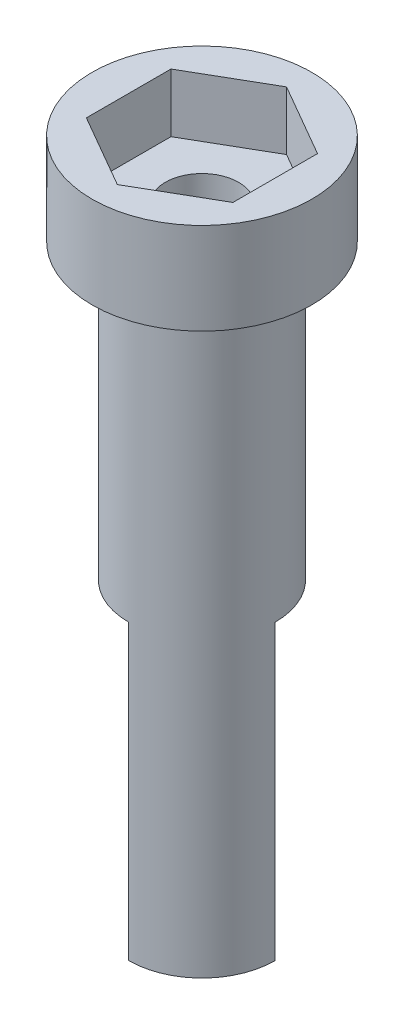
ISO-10303-21;
HEADER;
FILE_DESCRIPTION(('STEP AP214'),'2;1');
FILE_NAME('part.step','',(''),(''),'','','');
FILE_SCHEMA(('AUTOMOTIVE_DESIGN { 1 0 10303 214 1 1 1 1 }'));
ENDSEC;
DATA;
#1=APPLICATION_CONTEXT('core data for automotive mechanical design processes');
#2=APPLICATION_PROTOCOL_DEFINITION('international standard','automotive_design',2000,#1);
#3=PRODUCT_CONTEXT('',#1,'mechanical');
#4=PRODUCT('Part','Part','',(#3));
#5=PRODUCT_RELATED_PRODUCT_CATEGORY('part','',(#4));
#6=PRODUCT_DEFINITION_FORMATION('','',#4);
#7=PRODUCT_DEFINITION_CONTEXT('part definition',#1,'design');
#8=PRODUCT_DEFINITION('design','',#6,#7);
#9=PRODUCT_DEFINITION_SHAPE('','',#8);
#10=(LENGTH_UNIT() NAMED_UNIT(*) SI_UNIT(.MILLI.,.METRE.));
#11=(NAMED_UNIT(*) PLANE_ANGLE_UNIT() SI_UNIT($,.RADIAN.));
#12=(NAMED_UNIT(*) SI_UNIT($,.STERADIAN.) SOLID_ANGLE_UNIT());
#13=UNCERTAINTY_MEASURE_WITH_UNIT(LENGTH_MEASURE(1.E-05),#10,'distance_accuracy_value','');
#14=(GEOMETRIC_REPRESENTATION_CONTEXT(3) GLOBAL_UNCERTAINTY_ASSIGNED_CONTEXT((#13)) GLOBAL_UNIT_ASSIGNED_CONTEXT((#10,
#11,#12)) REPRESENTATION_CONTEXT('',''));
#15=CARTESIAN_POINT('',(0.,0.,0.));
#16=DIRECTION('',(0.,0.,1.));
#17=DIRECTION('',(1.,0.,0.));
#18=AXIS2_PLACEMENT_3D('',#15,#16,#17);
#19=CARTESIAN_POINT('',(0.,29.,0.));
#20=DIRECTION('',(0.,-1.,0.));
#21=DIRECTION('',(0.,0.,-1.));
#22=AXIS2_PLACEMENT_3D('',#19,#20,#21);
#23=CYLINDRICAL_SURFACE('',#22,2.);
#24=CARTESIAN_POINT('',(0.,26.5,0.));
#25=DIRECTION('',(0.,1.,0.));
#26=DIRECTION('',(0.,0.,1.));
#27=AXIS2_PLACEMENT_3D('',#24,#25,#26);
#28=CIRCLE('',#27,2.);
#29=CARTESIAN_POINT('',(0.,26.5,2.));
#30=VERTEX_POINT('',#29);
#31=EDGE_CURVE('E241',#30,#30,#28,.T.);
#32=ORIENTED_EDGE('',*,*,#31,.F.);
#33=EDGE_LOOP('',(#32));
#34=FACE_BOUND('',#33,.T.);
#35=DIRECTION('',(0.,-1.,0.));
#36=VECTOR('',#35,1.);
#37=CARTESIAN_POINT('',(2.,18.5,0.));
#38=LINE('',#37,#36);
#39=CARTESIAN_POINT('',(2.,18.5,0.));
#40=VERTEX_POINT('',#39);
#41=CARTESIAN_POINT('',(2.,10.5,0.));
#42=VERTEX_POINT('',#41);
#43=EDGE_CURVE('E146',#40,#42,#38,.T.);
#44=ORIENTED_EDGE('',*,*,#43,.F.);
#45=CARTESIAN_POINT('',(0.,18.5,0.));
#46=DIRECTION('',(0.,1.,0.));
#47=DIRECTION('',(0.,0.,1.));
#48=AXIS2_PLACEMENT_3D('',#45,#46,#47);
#49=CIRCLE('',#48,2.);
#50=CARTESIAN_POINT('',(0.,18.5,-2.));
#51=VERTEX_POINT('',#50);
#52=EDGE_CURVE('E152',#40,#51,#49,.T.);
#53=ORIENTED_EDGE('',*,*,#52,.T.);
#54=DIRECTION('',(0.,-1.,0.));
#55=VECTOR('',#54,1.);
#56=CARTESIAN_POINT('',(0.,18.5,-2.));
#57=LINE('',#56,#55);
#58=CARTESIAN_POINT('',(0.,10.5,-2.));
#59=VERTEX_POINT('',#58);
#60=EDGE_CURVE('E164',#51,#59,#57,.T.);
#61=ORIENTED_EDGE('',*,*,#60,.T.);
#62=CARTESIAN_POINT('',(0.,10.5,0.));
#63=DIRECTION('',(0.,1.,0.));
#64=DIRECTION('',(0.,0.,1.));
#65=AXIS2_PLACEMENT_3D('',#62,#63,#64);
#66=CIRCLE('',#65,2.);
#67=CARTESIAN_POINT('',(-2.,10.5,0.));
#68=VERTEX_POINT('',#67);
#69=EDGE_CURVE('E63',#59,#68,#66,.T.);
#70=ORIENTED_EDGE('',*,*,#69,.T.);
#71=DIRECTION('',(0.,-1.,0.));
#72=VECTOR('',#71,1.);
#73=CARTESIAN_POINT('',(-2.,18.5,0.));
#74=LINE('',#73,#72);
#75=CARTESIAN_POINT('',(-2.,18.5,0.));
#76=VERTEX_POINT('',#75);
#77=EDGE_CURVE('E183',#76,#68,#74,.T.);
#78=ORIENTED_EDGE('',*,*,#77,.F.);
#79=CARTESIAN_POINT('',(0.,18.5,0.));
#80=DIRECTION('',(0.,1.,0.));
#81=DIRECTION('',(0.,0.,1.));
#82=AXIS2_PLACEMENT_3D('',#79,#80,#81);
#83=CIRCLE('',#82,2.);
#84=CARTESIAN_POINT('',(0.,18.5,2.));
#85=VERTEX_POINT('',#84);
#86=EDGE_CURVE('E174',#76,#85,#83,.T.);
#87=ORIENTED_EDGE('',*,*,#86,.T.);
#88=DIRECTION('',(0.,-1.,0.));
#89=VECTOR('',#88,1.);
#90=CARTESIAN_POINT('',(0.,18.5,2.));
#91=LINE('',#90,#89);
#92=CARTESIAN_POINT('',(0.,10.5,2.));
#93=VERTEX_POINT('',#92);
#94=EDGE_CURVE('E180',#85,#93,#91,.T.);
#95=ORIENTED_EDGE('',*,*,#94,.T.);
#96=EDGE_CURVE('E163',#93,#42,#66,.T.);
#97=ORIENTED_EDGE('',*,*,#96,.T.);
#98=EDGE_LOOP('',(#44,#53,#61,#70,#78,#87,#95,#97));
#99=FACE_BOUND('',#98,.T.);
#100=ADVANCED_FACE('F41',(#34,#99),#23,.T.);
#101=CARTESIAN_POINT('',(0.,29.,0.));
#102=DIRECTION('',(0.,-1.,0.));
#103=DIRECTION('',(0.,0.,-1.));
#104=AXIS2_PLACEMENT_3D('',#101,#102,#103);
#105=CYLINDRICAL_SURFACE('',#104,1.);
#106=CARTESIAN_POINT('',(0.,27.4,0.));
#107=DIRECTION('',(0.,-1.,0.));
#108=DIRECTION('',(0.,0.,-1.));
#109=AXIS2_PLACEMENT_3D('',#106,#107,#108);
#110=CIRCLE('',#109,1.);
#111=CARTESIAN_POINT('',(0.,27.4,-1.));
#112=VERTEX_POINT('',#111);
#113=EDGE_CURVE('E237',#112,#112,#110,.T.);
#114=ORIENTED_EDGE('',*,*,#113,.F.);
#115=EDGE_LOOP('',(#114));
#116=FACE_BOUND('',#115,.T.);
#117=CARTESIAN_POINT('',(0.,18.5,0.));
#118=DIRECTION('',(0.,1.,0.));
#119=DIRECTION('',(0.,0.,1.));
#120=AXIS2_PLACEMENT_3D('',#117,#118,#119);
#121=CIRCLE('',#120,1.);
#122=CARTESIAN_POINT('',(1.,18.5,0.));
#123=VERTEX_POINT('',#122);
#124=CARTESIAN_POINT('',(0.,18.5,-1.));
#125=VERTEX_POINT('',#124);
#126=EDGE_CURVE('E11',#123,#125,#121,.T.);
#127=ORIENTED_EDGE('',*,*,#126,.F.);
#128=DIRECTION('',(0.,-1.,0.));
#129=VECTOR('',#128,1.);
#130=CARTESIAN_POINT('',(1.,29.,0.));
#131=LINE('',#130,#129);
#132=CARTESIAN_POINT('',(1.,10.5,0.));
#133=VERTEX_POINT('',#132);
#134=EDGE_CURVE('E149',#123,#133,#131,.T.);
#135=ORIENTED_EDGE('',*,*,#134,.T.);
#136=CARTESIAN_POINT('',(0.,10.5,0.));
#137=DIRECTION('',(0.,1.,0.));
#138=DIRECTION('',(0.,0.,1.));
#139=AXIS2_PLACEMENT_3D('',#136,#137,#138);
#140=CIRCLE('',#139,1.);
#141=CARTESIAN_POINT('',(0.,10.5,1.));
#142=VERTEX_POINT('',#141);
#143=EDGE_CURVE('E250',#142,#133,#140,.T.);
#144=ORIENTED_EDGE('',*,*,#143,.F.);
#145=DIRECTION('',(0.,-1.,0.));
#146=VECTOR('',#145,1.);
#147=CARTESIAN_POINT('',(0.,29.,1.));
#148=LINE('',#147,#146);
#149=CARTESIAN_POINT('',(0.,18.5,1.));
#150=VERTEX_POINT('',#149);
#151=EDGE_CURVE('E188',#150,#142,#148,.T.);
#152=ORIENTED_EDGE('',*,*,#151,.F.);
#153=CARTESIAN_POINT('',(0.,18.5,0.));
#154=DIRECTION('',(0.,1.,0.));
#155=DIRECTION('',(0.,0.,1.));
#156=AXIS2_PLACEMENT_3D('',#153,#154,#155);
#157=CIRCLE('',#156,1.);
#158=CARTESIAN_POINT('',(-1.,18.5,0.));
#159=VERTEX_POINT('',#158);
#160=EDGE_CURVE('E255',#159,#150,#157,.T.);
#161=ORIENTED_EDGE('',*,*,#160,.F.);
#162=DIRECTION('',(0.,-1.,0.));
#163=VECTOR('',#162,1.);
#164=CARTESIAN_POINT('',(-1.,29.,0.));
#165=LINE('',#164,#163);
#166=CARTESIAN_POINT('',(-1.,10.5,0.));
#167=VERTEX_POINT('',#166);
#168=EDGE_CURVE('E185',#167,#159,#165,.F.);
#169=ORIENTED_EDGE('',*,*,#168,.F.);
#170=CARTESIAN_POINT('',(0.,10.5,-1.));
#171=VERTEX_POINT('',#170);
#172=EDGE_CURVE('E190',#171,#167,#140,.T.);
#173=ORIENTED_EDGE('',*,*,#172,.F.);
#174=DIRECTION('',(0.,-1.,0.));
#175=VECTOR('',#174,1.);
#176=CARTESIAN_POINT('',(0.,29.,-1.));
#177=LINE('',#176,#175);
#178=EDGE_CURVE('E55',#171,#125,#177,.F.);
#179=ORIENTED_EDGE('',*,*,#178,.T.);
#180=EDGE_LOOP('',(#127,#135,#144,#152,#161,#169,#173,#179));
#181=FACE_BOUND('',#180,.T.);
#182=ADVANCED_FACE('F259',(#116,#181),#105,.F.);
#183=CARTESIAN_POINT('',(0.,10.5,0.));
#184=DIRECTION('',(0.,1.,0.));
#185=DIRECTION('',(0.,0.,1.));
#186=AXIS2_PLACEMENT_3D('',#183,#184,#185);
#187=PLANE('',#186);
#188=DIRECTION('',(-1.,0.,0.));
#189=VECTOR('',#188,1.);
#190=CARTESIAN_POINT('',(0.,10.5,0.));
#191=LINE('',#190,#189);
#192=EDGE_CURVE('E48',#42,#133,#191,.T.);
#193=ORIENTED_EDGE('',*,*,#192,.F.);
#194=ORIENTED_EDGE('',*,*,#96,.F.);
#195=DIRECTION('',(0.,0.,-1.));
#196=VECTOR('',#195,1.);
#197=CARTESIAN_POINT('',(0.,10.5,0.));
#198=LINE('',#197,#196);
#199=EDGE_CURVE('E247',#93,#142,#198,.T.);
#200=ORIENTED_EDGE('',*,*,#199,.T.);
#201=ORIENTED_EDGE('',*,*,#143,.T.);
#202=EDGE_LOOP('',(#193,#194,#200,#201));
#203=FACE_BOUND('',#202,.T.);
#204=ADVANCED_FACE('F261',(#203),#187,.F.);
#205=DIRECTION('',(0.,0.,1.));
#206=VECTOR('',#205,1.);
#207=CARTESIAN_POINT('',(0.,10.5,0.));
#208=LINE('',#207,#206);
#209=EDGE_CURVE('E153',#59,#171,#208,.T.);
#210=ORIENTED_EDGE('',*,*,#209,.T.);
#211=ORIENTED_EDGE('',*,*,#172,.T.);
#212=DIRECTION('',(1.,0.,0.));
#213=VECTOR('',#212,1.);
#214=CARTESIAN_POINT('',(0.,10.5,0.));
#215=LINE('',#214,#213);
#216=EDGE_CURVE('E171',#68,#167,#215,.T.);
#217=ORIENTED_EDGE('',*,*,#216,.F.);
#218=ORIENTED_EDGE('',*,*,#69,.F.);
#219=EDGE_LOOP('',(#210,#211,#217,#218));
#220=FACE_BOUND('',#219,.T.);
#221=ADVANCED_FACE('F276',(#220),#187,.F.);
#222=CARTESIAN_POINT('',(0.,29.,0.));
#223=DIRECTION('',(0.,1.,0.));
#224=DIRECTION('',(0.,0.,1.));
#225=AXIS2_PLACEMENT_3D('',#222,#223,#224);
#226=PLANE('',#225);
#227=CARTESIAN_POINT('',(0.,29.,0.));
#228=DIRECTION('',(0.,1.,0.));
#229=DIRECTION('',(0.,0.,1.));
#230=AXIS2_PLACEMENT_3D('',#227,#228,#229);
#231=CIRCLE('',#230,3.);
#232=CARTESIAN_POINT('',(0.,29.,3.));
#233=VERTEX_POINT('',#232);
#234=EDGE_CURVE('E242',#233,#233,#231,.T.);
#235=ORIENTED_EDGE('',*,*,#234,.T.);
#236=EDGE_LOOP('',(#235));
#237=FACE_BOUND('',#236,.T.);
#238=DIRECTION('',(0.,0.,-1.));
#239=VECTOR('',#238,1.);
#240=CARTESIAN_POINT('',(-2.,29.,0.));
#241=LINE('',#240,#239);
#242=CARTESIAN_POINT('',(-2.,29.,1.15470053837925));
#243=VERTEX_POINT('',#242);
#244=CARTESIAN_POINT('',(-2.,29.,-1.15470053837925));
#245=VERTEX_POINT('',#244);
#246=EDGE_CURVE('E197',#243,#245,#241,.T.);
#247=ORIENTED_EDGE('',*,*,#246,.T.);
#248=DIRECTION('',(0.866025403784439,0.,-0.5));
#249=VECTOR('',#248,1.);
#250=CARTESIAN_POINT('',(-1.,29.,-1.73205080756888));
#251=LINE('',#250,#249);
#252=CARTESIAN_POINT('',(0.,29.,-2.3094010767585));
#253=VERTEX_POINT('',#252);
#254=EDGE_CURVE('E192',#245,#253,#251,.T.);
#255=ORIENTED_EDGE('',*,*,#254,.T.);
#256=DIRECTION('',(0.866025403784439,0.,0.5));
#257=VECTOR('',#256,1.);
#258=CARTESIAN_POINT('',(1.,29.,-1.73205080756888));
#259=LINE('',#258,#257);
#260=CARTESIAN_POINT('',(2.,29.,-1.15470053837925));
#261=VERTEX_POINT('',#260);
#262=EDGE_CURVE('E210',#253,#261,#259,.T.);
#263=ORIENTED_EDGE('',*,*,#262,.T.);
#264=DIRECTION('',(0.,0.,1.));
#265=VECTOR('',#264,1.);
#266=CARTESIAN_POINT('',(2.,29.,0.));
#267=LINE('',#266,#265);
#268=CARTESIAN_POINT('',(2.,29.,1.15470053837925));
#269=VERTEX_POINT('',#268);
#270=EDGE_CURVE('E213',#261,#269,#267,.T.);
#271=ORIENTED_EDGE('',*,*,#270,.T.);
#272=DIRECTION('',(-0.866025403784439,0.,0.5));
#273=VECTOR('',#272,1.);
#274=CARTESIAN_POINT('',(1.,29.,1.73205080756888));
#275=LINE('',#274,#273);
#276=CARTESIAN_POINT('',(0.,29.,2.3094010767585));
#277=VERTEX_POINT('',#276);
#278=EDGE_CURVE('E216',#269,#277,#275,.T.);
#279=ORIENTED_EDGE('',*,*,#278,.T.);
#280=DIRECTION('',(-0.866025403784439,0.,-0.5));
#281=VECTOR('',#280,1.);
#282=CARTESIAN_POINT('',(-1.,29.,1.73205080756888));
#283=LINE('',#282,#281);
#284=EDGE_CURVE('E219',#277,#243,#283,.T.);
#285=ORIENTED_EDGE('',*,*,#284,.T.);
#286=EDGE_LOOP('',(#247,#255,#263,#271,#279,#285));
#287=FACE_BOUND('',#286,.T.);
#288=ADVANCED_FACE('F307',(#237,#287),#226,.T.);
#289=CARTESIAN_POINT('',(0.,26.5,0.));
#290=DIRECTION('',(0.,1.,0.));
#291=DIRECTION('',(0.,0.,1.));
#292=AXIS2_PLACEMENT_3D('',#289,#290,#291);
#293=CYLINDRICAL_SURFACE('',#292,3.);
#294=CARTESIAN_POINT('',(0.,26.5,0.));
#295=DIRECTION('',(0.,1.,0.));
#296=DIRECTION('',(0.,0.,1.));
#297=AXIS2_PLACEMENT_3D('',#294,#295,#296);
#298=CIRCLE('',#297,3.);
#299=CARTESIAN_POINT('',(0.,26.5,3.));
#300=VERTEX_POINT('',#299);
#301=EDGE_CURVE('E238',#300,#300,#298,.T.);
#302=ORIENTED_EDGE('',*,*,#301,.T.);
#303=EDGE_LOOP('',(#302));
#304=FACE_BOUND('',#303,.T.);
#305=ORIENTED_EDGE('',*,*,#234,.F.);
#306=EDGE_LOOP('',(#305));
#307=FACE_BOUND('',#306,.T.);
#308=ADVANCED_FACE('F301',(#304,#307),#293,.T.);
#309=CARTESIAN_POINT('',(0.,26.5,0.));
#310=DIRECTION('',(0.,1.,0.));
#311=DIRECTION('',(0.,0.,1.));
#312=AXIS2_PLACEMENT_3D('',#309,#310,#311);
#313=PLANE('',#312);
#314=ORIENTED_EDGE('',*,*,#31,.T.);
#315=EDGE_LOOP('',(#314));
#316=FACE_BOUND('',#315,.T.);
#317=ORIENTED_EDGE('',*,*,#301,.F.);
#318=EDGE_LOOP('',(#317));
#319=FACE_BOUND('',#318,.T.);
#320=ADVANCED_FACE('F297',(#316,#319),#313,.F.);
#321=CARTESIAN_POINT('',(-1.,27.4,-1.73205080756888));
#322=DIRECTION('',(0.5,0.,0.866025403784439));
#323=DIRECTION('',(0.866025403784439,0.,-0.5));
#324=AXIS2_PLACEMENT_3D('',#321,#322,#323);
#325=PLANE('',#324);
#326=ORIENTED_EDGE('',*,*,#254,.F.);
#327=DIRECTION('',(0.,1.,0.));
#328=VECTOR('',#327,1.);
#329=CARTESIAN_POINT('',(-2.,27.4,-1.15470053837925));
#330=LINE('',#329,#328);
#331=CARTESIAN_POINT('',(-2.,27.4,-1.15470053837925));
#332=VERTEX_POINT('',#331);
#333=EDGE_CURVE('E207',#332,#245,#330,.T.);
#334=ORIENTED_EDGE('',*,*,#333,.F.);
#335=DIRECTION('',(0.866025403784439,0.,-0.5));
#336=VECTOR('',#335,1.);
#337=CARTESIAN_POINT('',(-1.,27.4,-1.73205080756888));
#338=LINE('',#337,#336);
#339=CARTESIAN_POINT('',(0.,27.4,-2.3094010767585));
#340=VERTEX_POINT('',#339);
#341=EDGE_CURVE('E193',#332,#340,#338,.T.);
#342=ORIENTED_EDGE('',*,*,#341,.T.);
#343=DIRECTION('',(0.,1.,0.));
#344=VECTOR('',#343,1.);
#345=CARTESIAN_POINT('',(0.,27.4,-2.3094010767585));
#346=LINE('',#345,#344);
#347=EDGE_CURVE('E234',#340,#253,#346,.T.);
#348=ORIENTED_EDGE('',*,*,#347,.T.);
#349=EDGE_LOOP('',(#326,#334,#342,#348));
#350=FACE_BOUND('',#349,.T.);
#351=ADVANCED_FACE('F300',(#350),#325,.T.);
#352=CARTESIAN_POINT('',(1.,27.4,-1.73205080756888));
#353=DIRECTION('',(-0.5,0.,0.866025403784439));
#354=DIRECTION('',(0.866025403784439,0.,0.5));
#355=AXIS2_PLACEMENT_3D('',#352,#353,#354);
#356=PLANE('',#355);
#357=ORIENTED_EDGE('',*,*,#262,.F.);
#358=ORIENTED_EDGE('',*,*,#347,.F.);
#359=DIRECTION('',(0.866025403784439,0.,0.5));
#360=VECTOR('',#359,1.);
#361=CARTESIAN_POINT('',(1.,27.4,-1.73205080756888));
#362=LINE('',#361,#360);
#363=CARTESIAN_POINT('',(2.,27.4,-1.15470053837925));
#364=VERTEX_POINT('',#363);
#365=EDGE_CURVE('E196',#340,#364,#362,.T.);
#366=ORIENTED_EDGE('',*,*,#365,.T.);
#367=DIRECTION('',(0.,1.,0.));
#368=VECTOR('',#367,1.);
#369=CARTESIAN_POINT('',(2.,27.4,-1.15470053837925));
#370=LINE('',#369,#368);
#371=EDGE_CURVE('E232',#364,#261,#370,.T.);
#372=ORIENTED_EDGE('',*,*,#371,.T.);
#373=EDGE_LOOP('',(#357,#358,#366,#372));
#374=FACE_BOUND('',#373,.T.);
#375=ADVANCED_FACE('F330',(#374),#356,.T.);
#376=CARTESIAN_POINT('',(2.,27.4,0.));
#377=DIRECTION('',(-1.,0.,0.));
#378=DIRECTION('',(0.,0.,1.));
#379=AXIS2_PLACEMENT_3D('',#376,#377,#378);
#380=PLANE('',#379);
#381=ORIENTED_EDGE('',*,*,#270,.F.);
#382=ORIENTED_EDGE('',*,*,#371,.F.);
#383=DIRECTION('',(0.,0.,1.));
#384=VECTOR('',#383,1.);
#385=CARTESIAN_POINT('',(2.,27.4,0.));
#386=LINE('',#385,#384);
#387=CARTESIAN_POINT('',(2.,27.4,1.15470053837925));
#388=VERTEX_POINT('',#387);
#389=EDGE_CURVE('E199',#364,#388,#386,.T.);
#390=ORIENTED_EDGE('',*,*,#389,.T.);
#391=DIRECTION('',(0.,1.,0.));
#392=VECTOR('',#391,1.);
#393=CARTESIAN_POINT('',(2.,27.4,1.15470053837925));
#394=LINE('',#393,#392);
#395=EDGE_CURVE('E230',#388,#269,#394,.T.);
#396=ORIENTED_EDGE('',*,*,#395,.T.);
#397=EDGE_LOOP('',(#381,#382,#390,#396));
#398=FACE_BOUND('',#397,.T.);
#399=ADVANCED_FACE('F333',(#398),#380,.T.);
#400=CARTESIAN_POINT('',(1.,27.4,1.73205080756888));
#401=DIRECTION('',(-0.5,0.,-0.866025403784439));
#402=DIRECTION('',(-0.866025403784439,0.,0.5));
#403=AXIS2_PLACEMENT_3D('',#400,#401,#402);
#404=PLANE('',#403);
#405=ORIENTED_EDGE('',*,*,#278,.F.);
#406=ORIENTED_EDGE('',*,*,#395,.F.);
#407=DIRECTION('',(-0.866025403784439,0.,0.5));
#408=VECTOR('',#407,1.);
#409=CARTESIAN_POINT('',(1.,27.4,1.73205080756888));
#410=LINE('',#409,#408);
#411=CARTESIAN_POINT('',(0.,27.4,2.3094010767585));
#412=VERTEX_POINT('',#411);
#413=EDGE_CURVE('E201',#388,#412,#410,.T.);
#414=ORIENTED_EDGE('',*,*,#413,.T.);
#415=DIRECTION('',(0.,1.,0.));
#416=VECTOR('',#415,1.);
#417=CARTESIAN_POINT('',(0.,27.4,2.3094010767585));
#418=LINE('',#417,#416);
#419=EDGE_CURVE('E228',#412,#277,#418,.T.);
#420=ORIENTED_EDGE('',*,*,#419,.T.);
#421=EDGE_LOOP('',(#405,#406,#414,#420));
#422=FACE_BOUND('',#421,.T.);
#423=ADVANCED_FACE('F337',(#422),#404,.T.);
#424=CARTESIAN_POINT('',(-1.,27.4,1.73205080756888));
#425=DIRECTION('',(0.5,0.,-0.866025403784439));
#426=DIRECTION('',(-0.866025403784439,0.,-0.5));
#427=AXIS2_PLACEMENT_3D('',#424,#425,#426);
#428=PLANE('',#427);
#429=ORIENTED_EDGE('',*,*,#284,.F.);
#430=ORIENTED_EDGE('',*,*,#419,.F.);
#431=DIRECTION('',(-0.866025403784439,0.,-0.5));
#432=VECTOR('',#431,1.);
#433=CARTESIAN_POINT('',(-1.,27.4,1.73205080756888));
#434=LINE('',#433,#432);
#435=CARTESIAN_POINT('',(-2.,27.4,1.15470053837925));
#436=VERTEX_POINT('',#435);
#437=EDGE_CURVE('E203',#412,#436,#434,.T.);
#438=ORIENTED_EDGE('',*,*,#437,.T.);
#439=DIRECTION('',(0.,1.,0.));
#440=VECTOR('',#439,1.);
#441=CARTESIAN_POINT('',(-2.,27.4,1.15470053837925));
#442=LINE('',#441,#440);
#443=EDGE_CURVE('E226',#436,#243,#442,.T.);
#444=ORIENTED_EDGE('',*,*,#443,.T.);
#445=EDGE_LOOP('',(#429,#430,#438,#444));
#446=FACE_BOUND('',#445,.T.);
#447=ADVANCED_FACE('F340',(#446),#428,.T.);
#448=CARTESIAN_POINT('',(-2.,27.4,0.));
#449=DIRECTION('',(1.,0.,0.));
#450=DIRECTION('',(0.,0.,-1.));
#451=AXIS2_PLACEMENT_3D('',#448,#449,#450);
#452=PLANE('',#451);
#453=ORIENTED_EDGE('',*,*,#246,.F.);
#454=ORIENTED_EDGE('',*,*,#443,.F.);
#455=DIRECTION('',(0.,0.,-1.));
#456=VECTOR('',#455,1.);
#457=CARTESIAN_POINT('',(-2.,27.4,0.));
#458=LINE('',#457,#456);
#459=EDGE_CURVE('E205',#436,#332,#458,.T.);
#460=ORIENTED_EDGE('',*,*,#459,.T.);
#461=ORIENTED_EDGE('',*,*,#333,.T.);
#462=EDGE_LOOP('',(#453,#454,#460,#461));
#463=FACE_BOUND('',#462,.T.);
#464=ADVANCED_FACE('F317',(#463),#452,.T.);
#465=CARTESIAN_POINT('',(0.,27.4,0.));
#466=DIRECTION('',(0.,-1.,0.));
#467=DIRECTION('',(0.,0.,-1.));
#468=AXIS2_PLACEMENT_3D('',#465,#466,#467);
#469=PLANE('',#468);
#470=ORIENTED_EDGE('',*,*,#113,.T.);
#471=EDGE_LOOP('',(#470));
#472=FACE_BOUND('',#471,.T.);
#473=ORIENTED_EDGE('',*,*,#341,.F.);
#474=ORIENTED_EDGE('',*,*,#459,.F.);
#475=ORIENTED_EDGE('',*,*,#437,.F.);
#476=ORIENTED_EDGE('',*,*,#413,.F.);
#477=ORIENTED_EDGE('',*,*,#389,.F.);
#478=ORIENTED_EDGE('',*,*,#365,.F.);
#479=EDGE_LOOP('',(#473,#474,#475,#476,#477,#478));
#480=FACE_BOUND('',#479,.T.);
#481=ADVANCED_FACE('F324',(#472,#480),#469,.F.);
#482=CARTESIAN_POINT('',(0.,18.5,0.));
#483=DIRECTION('',(1.,0.,0.));
#484=DIRECTION('',(0.,0.,-1.));
#485=AXIS2_PLACEMENT_3D('',#482,#483,#484);
#486=PLANE('',#485);
#487=ORIENTED_EDGE('',*,*,#151,.T.);
#488=ORIENTED_EDGE('',*,*,#199,.F.);
#489=ORIENTED_EDGE('',*,*,#94,.F.);
#490=DIRECTION('',(0.,0.,1.));
#491=VECTOR('',#490,1.);
#492=CARTESIAN_POINT('',(0.,18.5,0.));
#493=LINE('',#492,#491);
#494=EDGE_CURVE('E172',#150,#85,#493,.T.);
#495=ORIENTED_EDGE('',*,*,#494,.F.);
#496=EDGE_LOOP('',(#487,#488,#489,#495));
#497=FACE_BOUND('',#496,.T.);
#498=ADVANCED_FACE('F264',(#497),#486,.F.);
#499=CARTESIAN_POINT('',(0.,18.5,0.));
#500=DIRECTION('',(0.,0.,-1.));
#501=DIRECTION('',(-1.,0.,0.));
#502=AXIS2_PLACEMENT_3D('',#499,#500,#501);
#503=PLANE('',#502);
#504=ORIENTED_EDGE('',*,*,#168,.T.);
#505=DIRECTION('',(1.,0.,0.));
#506=VECTOR('',#505,1.);
#507=CARTESIAN_POINT('',(0.,18.5,0.));
#508=LINE('',#507,#506);
#509=EDGE_CURVE('E177',#76,#159,#508,.T.);
#510=ORIENTED_EDGE('',*,*,#509,.F.);
#511=ORIENTED_EDGE('',*,*,#77,.T.);
#512=ORIENTED_EDGE('',*,*,#216,.T.);
#513=EDGE_LOOP('',(#504,#510,#511,#512));
#514=FACE_BOUND('',#513,.T.);
#515=ADVANCED_FACE('F271',(#514),#503,.F.);
#516=CARTESIAN_POINT('',(0.,18.5,0.));
#517=DIRECTION('',(0.,1.,0.));
#518=DIRECTION('',(0.,0.,1.));
#519=AXIS2_PLACEMENT_3D('',#516,#517,#518);
#520=PLANE('',#519);
#521=ORIENTED_EDGE('',*,*,#160,.T.);
#522=ORIENTED_EDGE('',*,*,#494,.T.);
#523=ORIENTED_EDGE('',*,*,#86,.F.);
#524=ORIENTED_EDGE('',*,*,#509,.T.);
#525=EDGE_LOOP('',(#521,#522,#523,#524));
#526=FACE_BOUND('',#525,.T.);
#527=ADVANCED_FACE('F268',(#526),#520,.F.);
#528=CARTESIAN_POINT('',(0.,18.5,0.));
#529=DIRECTION('',(0.,0.,-1.));
#530=DIRECTION('',(-1.,0.,0.));
#531=AXIS2_PLACEMENT_3D('',#528,#529,#530);
#532=PLANE('',#531);
#533=DIRECTION('',(1.,0.,0.));
#534=VECTOR('',#533,1.);
#535=CARTESIAN_POINT('',(0.,18.5,0.));
#536=LINE('',#535,#534);
#537=EDGE_CURVE('E142',#123,#40,#536,.T.);
#538=ORIENTED_EDGE('',*,*,#537,.T.);
#539=ORIENTED_EDGE('',*,*,#43,.T.);
#540=ORIENTED_EDGE('',*,*,#192,.T.);
#541=ORIENTED_EDGE('',*,*,#134,.F.);
#542=EDGE_LOOP('',(#538,#539,#540,#541));
#543=FACE_BOUND('',#542,.T.);
#544=ADVANCED_FACE('F144',(#543),#532,.T.);
#545=CARTESIAN_POINT('',(0.,18.5,0.));
#546=DIRECTION('',(1.,0.,0.));
#547=DIRECTION('',(0.,0.,-1.));
#548=AXIS2_PLACEMENT_3D('',#545,#546,#547);
#549=PLANE('',#548);
#550=ORIENTED_EDGE('',*,*,#209,.F.);
#551=ORIENTED_EDGE('',*,*,#60,.F.);
#552=DIRECTION('',(0.,0.,1.));
#553=VECTOR('',#552,1.);
#554=CARTESIAN_POINT('',(0.,18.5,0.));
#555=LINE('',#554,#553);
#556=EDGE_CURVE('E158',#51,#125,#555,.T.);
#557=ORIENTED_EDGE('',*,*,#556,.T.);
#558=ORIENTED_EDGE('',*,*,#178,.F.);
#559=EDGE_LOOP('',(#550,#551,#557,#558));
#560=FACE_BOUND('',#559,.T.);
#561=ADVANCED_FACE('F278',(#560),#549,.T.);
#562=CARTESIAN_POINT('',(0.,18.5,0.));
#563=DIRECTION('',(0.,1.,0.));
#564=DIRECTION('',(0.,0.,1.));
#565=AXIS2_PLACEMENT_3D('',#562,#563,#564);
#566=PLANE('',#565);
#567=ORIENTED_EDGE('',*,*,#126,.T.);
#568=ORIENTED_EDGE('',*,*,#556,.F.);
#569=ORIENTED_EDGE('',*,*,#52,.F.);
#570=ORIENTED_EDGE('',*,*,#537,.F.);
#571=EDGE_LOOP('',(#567,#568,#569,#570));
#572=FACE_BOUND('',#571,.T.);
#573=ADVANCED_FACE('F157',(#572),#566,.F.);
#574=CLOSED_SHELL('',(#100,#182,#204,#221,#288,#308,#320,#351,#375,#399,#423,#447,#464,#481,
#498,#515,#527,#544,#561,#573));
#575=MANIFOLD_SOLID_BREP('B2',#574);
#576=ADVANCED_BREP_SHAPE_REPRESENTATION('',(#18,#575),#14);
#577=SHAPE_DEFINITION_REPRESENTATION(#9,#576);
ENDSEC;
END-ISO-10303-21;
